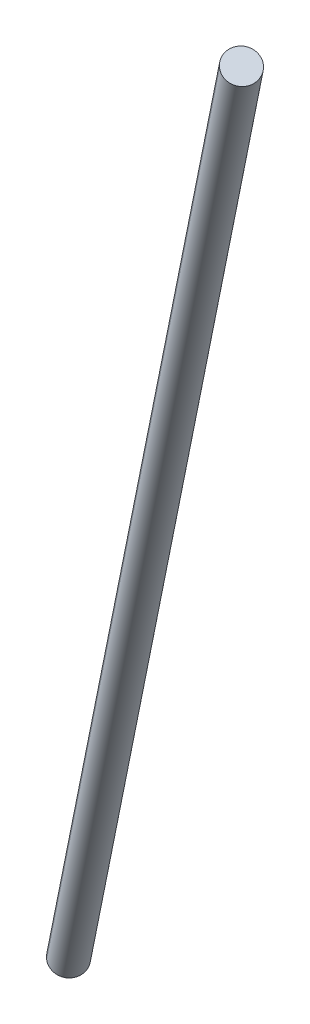
ISO-10303-21;
HEADER;
FILE_DESCRIPTION(('STEP AP214'),'2;1');
FILE_NAME('part.step','',(''),(''),'','','');
FILE_SCHEMA(('AUTOMOTIVE_DESIGN { 1 0 10303 214 1 1 1 1 }'));
ENDSEC;
DATA;
#1=APPLICATION_CONTEXT('core data for automotive mechanical design processes');
#2=APPLICATION_PROTOCOL_DEFINITION('international standard','automotive_design',2000,#1);
#3=PRODUCT_CONTEXT('',#1,'mechanical');
#4=PRODUCT('Part','Part','',(#3));
#5=PRODUCT_RELATED_PRODUCT_CATEGORY('part','',(#4));
#6=PRODUCT_DEFINITION_FORMATION('','',#4);
#7=PRODUCT_DEFINITION_CONTEXT('part definition',#1,'design');
#8=PRODUCT_DEFINITION('design','',#6,#7);
#9=PRODUCT_DEFINITION_SHAPE('','',#8);
#10=(LENGTH_UNIT() NAMED_UNIT(*) SI_UNIT(.MILLI.,.METRE.));
#11=(NAMED_UNIT(*) PLANE_ANGLE_UNIT() SI_UNIT($,.RADIAN.));
#12=(NAMED_UNIT(*) SI_UNIT($,.STERADIAN.) SOLID_ANGLE_UNIT());
#13=UNCERTAINTY_MEASURE_WITH_UNIT(LENGTH_MEASURE(1.E-05),#10,'distance_accuracy_value','');
#14=(GEOMETRIC_REPRESENTATION_CONTEXT(3) GLOBAL_UNCERTAINTY_ASSIGNED_CONTEXT((#13)) GLOBAL_UNIT_ASSIGNED_CONTEXT((#10,
#11,#12)) REPRESENTATION_CONTEXT('',''));
#15=CARTESIAN_POINT('',(0.,0.,0.));
#16=DIRECTION('',(0.,0.,1.));
#17=DIRECTION('',(1.,0.,0.));
#18=AXIS2_PLACEMENT_3D('',#15,#16,#17);
#19=CARTESIAN_POINT('',(91.712312588881,347.134063670447,128.623047316218));
#20=DIRECTION('',(-0.417712302811113,-0.85498913219839,-0.307424813414405));
#21=DIRECTION('',(-0.679166601994634,0.518581418057691,-0.519428570238813));
#22=AXIS2_PLACEMENT_3D('',#19,#20,#21);
#23=PLANE('',#22);
#24=CARTESIAN_POINT('',(91.712312588881,347.134063670447,128.623047316218));
#25=DIRECTION('',(-0.417712302811113,-0.85498913219839,-0.307424813414405));
#26=DIRECTION('',(-0.603530578194096,0.00817903832484265,0.797297901989451));
#27=AXIS2_PLACEMENT_3D('',#24,#25,#26);
#28=CIRCLE('',#27,1.5);
#29=CARTESIAN_POINT('',(92.6176084561721,347.12179511296,127.427100463234));
#30=VERTEX_POINT('',#29);
#31=CARTESIAN_POINT('',(90.8070167215899,347.146332227934,129.818994169202));
#32=VERTEX_POINT('',#31);
#33=EDGE_CURVE('E11',#30,#32,#28,.T.);
#34=ORIENTED_EDGE('',*,*,#33,.F.);
#35=CARTESIAN_POINT('',(91.712312588881,347.134063670447,128.623047316218));
#36=DIRECTION('',(-0.417712302811113,-0.85498913219839,-0.307424813414405));
#37=DIRECTION('',(-0.603530578194096,0.00817903832484265,0.797297901989451));
#38=AXIS2_PLACEMENT_3D('',#35,#36,#37);
#39=CIRCLE('',#38,1.5);
#40=EDGE_CURVE('E83',#32,#30,#39,.T.);
#41=ORIENTED_EDGE('',*,*,#40,.F.);
#42=EDGE_LOOP('',(#34,#41));
#43=FACE_BOUND('',#42,.T.);
#44=ADVANCED_FACE('F38',(#43),#23,.F.);
#45=CARTESIAN_POINT('',(29.0554671672141,218.885693840689,82.5093253040572));
#46=DIRECTION('',(-0.417712302811113,-0.85498913219839,-0.307424813414405));
#47=DIRECTION('',(-0.679166601994634,0.518581418057691,-0.519428570238813));
#48=AXIS2_PLACEMENT_3D('',#45,#46,#47);
#49=PLANE('',#48);
#50=CARTESIAN_POINT('',(29.0554671672141,218.885693840689,82.5093253040572));
#51=DIRECTION('',(-0.417712302811113,-0.85498913219839,-0.307424813414405));
#52=DIRECTION('',(-0.603530578194096,0.00817903832484265,0.797297901989451));
#53=AXIS2_PLACEMENT_3D('',#50,#51,#52);
#54=CIRCLE('',#53,1.5);
#55=CARTESIAN_POINT('',(29.9607630345052,218.873425283201,81.3133784510731));
#56=VERTEX_POINT('',#55);
#57=CARTESIAN_POINT('',(28.1501712999229,218.897962398176,83.7052721570414));
#58=VERTEX_POINT('',#57);
#59=EDGE_CURVE('E48',#56,#58,#54,.T.);
#60=ORIENTED_EDGE('',*,*,#59,.T.);
#61=CARTESIAN_POINT('',(29.0554671672141,218.885693840689,82.5093253040572));
#62=DIRECTION('',(-0.417712302811113,-0.85498913219839,-0.307424813414405));
#63=DIRECTION('',(-0.603530578194096,0.00817903832484265,0.797297901989451));
#64=AXIS2_PLACEMENT_3D('',#61,#62,#63);
#65=CIRCLE('',#64,1.5);
#66=EDGE_CURVE('E75',#58,#56,#65,.T.);
#67=ORIENTED_EDGE('',*,*,#66,.T.);
#68=EDGE_LOOP('',(#60,#67));
#69=FACE_BOUND('',#68,.T.);
#70=ADVANCED_FACE('F73',(#69),#49,.T.);
#71=CARTESIAN_POINT('',(29.0554671672141,218.885693840689,82.5093253040572));
#72=DIRECTION('',(0.417712302811113,0.85498913219839,0.307424813414405));
#73=DIRECTION('',(0.603530578194096,-0.00817903832484265,-0.797297901989451));
#74=AXIS2_PLACEMENT_3D('',#71,#72,#73);
#75=CYLINDRICAL_SURFACE('',#74,1.5);
#76=DIRECTION('',(0.417712302811113,0.85498913219839,0.307424813414405));
#77=VECTOR('',#76,1.);
#78=CARTESIAN_POINT('',(28.1501712999229,218.897962398176,83.7052721570414));
#79=LINE('',#78,#77);
#80=EDGE_CURVE('E41',#58,#32,#79,.T.);
#81=ORIENTED_EDGE('',*,*,#80,.F.);
#82=ORIENTED_EDGE('',*,*,#59,.F.);
#83=DIRECTION('',(0.417712302811113,0.85498913219839,0.307424813414405));
#84=VECTOR('',#83,1.);
#85=CARTESIAN_POINT('',(29.9607630345052,218.873425283201,81.3133784510731));
#86=LINE('',#85,#84);
#87=EDGE_CURVE('E77',#56,#30,#86,.T.);
#88=ORIENTED_EDGE('',*,*,#87,.T.);
#89=ORIENTED_EDGE('',*,*,#33,.T.);
#90=EDGE_LOOP('',(#81,#82,#88,#89));
#91=FACE_BOUND('',#90,.T.);
#92=ADVANCED_FACE('F79',(#91),#75,.T.);
#93=CARTESIAN_POINT('',(29.0554671672141,218.885693840689,82.5093253040572));
#94=DIRECTION('',(0.417712302811113,0.85498913219839,0.307424813414405));
#95=DIRECTION('',(0.603530578194096,-0.00817903832484265,-0.797297901989451));
#96=AXIS2_PLACEMENT_3D('',#93,#94,#95);
#97=CYLINDRICAL_SURFACE('',#96,1.5);
#98=ORIENTED_EDGE('',*,*,#66,.F.);
#99=ORIENTED_EDGE('',*,*,#80,.T.);
#100=ORIENTED_EDGE('',*,*,#40,.T.);
#101=ORIENTED_EDGE('',*,*,#87,.F.);
#102=EDGE_LOOP('',(#98,#99,#100,#101));
#103=FACE_BOUND('',#102,.T.);
#104=ADVANCED_FACE('F84',(#103),#97,.T.);
#105=CLOSED_SHELL('',(#44,#70,#92,#104));
#106=MANIFOLD_SOLID_BREP('B2',#105);
#107=ADVANCED_BREP_SHAPE_REPRESENTATION('',(#18,#106),#14);
#108=SHAPE_DEFINITION_REPRESENTATION(#9,#107);
ENDSEC;
END-ISO-10303-21;
